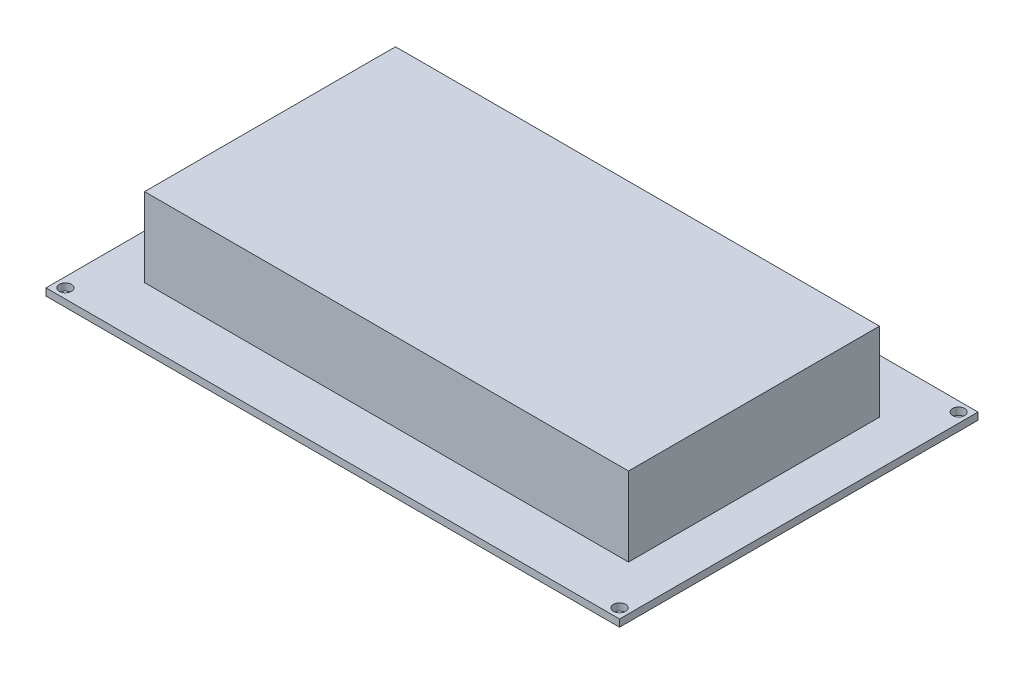
ISO-10303-21;
HEADER;
FILE_DESCRIPTION(('STEP AP214'),'2;1');
FILE_NAME('part.step','',(''),(''),'','','');
FILE_SCHEMA(('AUTOMOTIVE_DESIGN { 1 0 10303 214 1 1 1 1 }'));
ENDSEC;
DATA;
#1=APPLICATION_CONTEXT('core data for automotive mechanical design processes');
#2=APPLICATION_PROTOCOL_DEFINITION('international standard','automotive_design',2000,#1);
#3=PRODUCT_CONTEXT('',#1,'mechanical');
#4=PRODUCT('Part','Part','',(#3));
#5=PRODUCT_RELATED_PRODUCT_CATEGORY('part','',(#4));
#6=PRODUCT_DEFINITION_FORMATION('','',#4);
#7=PRODUCT_DEFINITION_CONTEXT('part definition',#1,'design');
#8=PRODUCT_DEFINITION('design','',#6,#7);
#9=PRODUCT_DEFINITION_SHAPE('','',#8);
#10=(LENGTH_UNIT() NAMED_UNIT(*) SI_UNIT(.MILLI.,.METRE.));
#11=(NAMED_UNIT(*) PLANE_ANGLE_UNIT() SI_UNIT($,.RADIAN.));
#12=(NAMED_UNIT(*) SI_UNIT($,.STERADIAN.) SOLID_ANGLE_UNIT());
#13=UNCERTAINTY_MEASURE_WITH_UNIT(LENGTH_MEASURE(1.E-05),#10,'distance_accuracy_value','');
#14=(GEOMETRIC_REPRESENTATION_CONTEXT(3) GLOBAL_UNCERTAINTY_ASSIGNED_CONTEXT((#13)) GLOBAL_UNIT_ASSIGNED_CONTEXT((#10,
#11,#12)) REPRESENTATION_CONTEXT('',''));
#15=CARTESIAN_POINT('',(0.,0.,0.));
#16=DIRECTION('',(0.,0.,1.));
#17=DIRECTION('',(1.,0.,0.));
#18=AXIS2_PLACEMENT_3D('',#15,#16,#17);
#19=CARTESIAN_POINT('',(0.,2.,0.));
#20=DIRECTION('',(0.,1.,0.));
#21=DIRECTION('',(0.,0.,1.));
#22=AXIS2_PLACEMENT_3D('',#19,#20,#21);
#23=PLANE('',#22);
#24=CARTESIAN_POINT('',(77.3000000000001,2.,47.3));
#25=DIRECTION('',(0.,1.,0.));
#26=DIRECTION('',(0.,0.,-1.));
#27=AXIS2_PLACEMENT_3D('',#24,#25,#26);
#28=CIRCLE('',#27,1.70000000000001);
#29=CARTESIAN_POINT('',(77.3000000000001,2.,45.6));
#30=VERTEX_POINT('',#29);
#31=EDGE_CURVE('E146',#30,#30,#28,.T.);
#32=ORIENTED_EDGE('',*,*,#31,.F.);
#33=EDGE_LOOP('',(#32));
#34=FACE_BOUND('',#33,.T.);
#35=CARTESIAN_POINT('',(-77.3,2.,47.3));
#36=DIRECTION('',(0.,1.,0.));
#37=DIRECTION('',(0.,0.,1.));
#38=AXIS2_PLACEMENT_3D('',#35,#36,#37);
#39=CIRCLE('',#38,1.70000000000001);
#40=CARTESIAN_POINT('',(-77.3,2.,49.));
#41=VERTEX_POINT('',#40);
#42=EDGE_CURVE('E152',#41,#41,#39,.T.);
#43=ORIENTED_EDGE('',*,*,#42,.F.);
#44=EDGE_LOOP('',(#43));
#45=FACE_BOUND('',#44,.T.);
#46=CARTESIAN_POINT('',(-77.3,2.,-47.3));
#47=DIRECTION('',(0.,1.,0.));
#48=DIRECTION('',(0.,0.,-1.));
#49=AXIS2_PLACEMENT_3D('',#46,#47,#48);
#50=CIRCLE('',#49,1.70000000000001);
#51=CARTESIAN_POINT('',(-77.3,2.,-49.));
#52=VERTEX_POINT('',#51);
#53=EDGE_CURVE('E134',#52,#52,#50,.T.);
#54=ORIENTED_EDGE('',*,*,#53,.F.);
#55=EDGE_LOOP('',(#54));
#56=FACE_BOUND('',#55,.T.);
#57=CARTESIAN_POINT('',(77.3,2.,-47.3));
#58=DIRECTION('',(0.,1.,0.));
#59=DIRECTION('',(0.,0.,1.));
#60=AXIS2_PLACEMENT_3D('',#57,#58,#59);
#61=CIRCLE('',#60,1.70000000000001);
#62=CARTESIAN_POINT('',(77.3,2.,-45.6));
#63=VERTEX_POINT('',#62);
#64=EDGE_CURVE('E145',#63,#63,#61,.T.);
#65=ORIENTED_EDGE('',*,*,#64,.F.);
#66=EDGE_LOOP('',(#65));
#67=FACE_BOUND('',#66,.T.);
#68=DIRECTION('',(0.,0.,1.));
#69=VECTOR('',#68,1.);
#70=CARTESIAN_POINT('',(-80.,2.,50.0000000000001));
#71=LINE('',#70,#69);
#72=CARTESIAN_POINT('',(-80.,2.,-50.));
#73=VERTEX_POINT('',#72);
#74=CARTESIAN_POINT('',(-80.,2.,50.0000000000001));
#75=VERTEX_POINT('',#74);
#76=EDGE_CURVE('E163',#73,#75,#71,.T.);
#77=ORIENTED_EDGE('',*,*,#76,.T.);
#78=DIRECTION('',(1.,0.,0.));
#79=VECTOR('',#78,1.);
#80=CARTESIAN_POINT('',(80.,2.,50.));
#81=LINE('',#80,#79);
#82=CARTESIAN_POINT('',(80.,2.,50.));
#83=VERTEX_POINT('',#82);
#84=EDGE_CURVE('E87',#75,#83,#81,.T.);
#85=ORIENTED_EDGE('',*,*,#84,.T.);
#86=DIRECTION('',(0.,0.,-1.));
#87=VECTOR('',#86,1.);
#88=CARTESIAN_POINT('',(80.,2.,50.));
#89=LINE('',#88,#87);
#90=CARTESIAN_POINT('',(80.,2.,-50.));
#91=VERTEX_POINT('',#90);
#92=EDGE_CURVE('E166',#83,#91,#89,.T.);
#93=ORIENTED_EDGE('',*,*,#92,.T.);
#94=DIRECTION('',(-1.,0.,0.));
#95=VECTOR('',#94,1.);
#96=CARTESIAN_POINT('',(80.,2.,-50.));
#97=LINE('',#96,#95);
#98=EDGE_CURVE('E59',#91,#73,#97,.T.);
#99=ORIENTED_EDGE('',*,*,#98,.T.);
#100=EDGE_LOOP('',(#77,#85,#93,#99));
#101=FACE_BOUND('',#100,.T.);
#102=DIRECTION('',(1.,0.,0.));
#103=VECTOR('',#102,1.);
#104=CARTESIAN_POINT('',(67.5,2.,35.));
#105=LINE('',#104,#103);
#106=CARTESIAN_POINT('',(-67.5,2.,35.));
#107=VERTEX_POINT('',#106);
#108=CARTESIAN_POINT('',(67.5,2.,35.));
#109=VERTEX_POINT('',#108);
#110=EDGE_CURVE('E333',#107,#109,#105,.T.);
#111=ORIENTED_EDGE('',*,*,#110,.F.);
#112=DIRECTION('',(0.,0.,1.));
#113=VECTOR('',#112,1.);
#114=CARTESIAN_POINT('',(-67.5,2.,35.));
#115=LINE('',#114,#113);
#116=CARTESIAN_POINT('',(-67.5,2.,-35.));
#117=VERTEX_POINT('',#116);
#118=EDGE_CURVE('E132',#117,#107,#115,.T.);
#119=ORIENTED_EDGE('',*,*,#118,.F.);
#120=DIRECTION('',(-1.,0.,0.));
#121=VECTOR('',#120,1.);
#122=CARTESIAN_POINT('',(67.5,2.,-35.));
#123=LINE('',#122,#121);
#124=CARTESIAN_POINT('',(67.5,2.,-35.));
#125=VERTEX_POINT('',#124);
#126=EDGE_CURVE('E128',#125,#117,#123,.T.);
#127=ORIENTED_EDGE('',*,*,#126,.F.);
#128=DIRECTION('',(0.,0.,-1.));
#129=VECTOR('',#128,1.);
#130=CARTESIAN_POINT('',(67.5,2.,35.));
#131=LINE('',#130,#129);
#132=EDGE_CURVE('E330',#109,#125,#131,.T.);
#133=ORIENTED_EDGE('',*,*,#132,.F.);
#134=EDGE_LOOP('',(#111,#119,#127,#133));
#135=FACE_BOUND('',#134,.T.);
#136=ADVANCED_FACE('F35',(#34,#45,#56,#67,#101,#135),#23,.T.);
#137=CARTESIAN_POINT('',(-80.,2.,50.0000000000001));
#138=DIRECTION('',(1.,0.,0.));
#139=DIRECTION('',(0.,0.,-1.));
#140=AXIS2_PLACEMENT_3D('',#137,#138,#139);
#141=PLANE('',#140);
#142=DIRECTION('',(0.,0.,1.));
#143=VECTOR('',#142,1.);
#144=CARTESIAN_POINT('',(-80.,0.,50.0000000000001));
#145=LINE('',#144,#143);
#146=CARTESIAN_POINT('',(-80.,0.,-50.));
#147=VERTEX_POINT('',#146);
#148=CARTESIAN_POINT('',(-80.,0.,50.0000000000001));
#149=VERTEX_POINT('',#148);
#150=EDGE_CURVE('E160',#147,#149,#145,.T.);
#151=ORIENTED_EDGE('',*,*,#150,.T.);
#152=DIRECTION('',(0.,-1.,0.));
#153=VECTOR('',#152,1.);
#154=CARTESIAN_POINT('',(-80.,2.,50.0000000000001));
#155=LINE('',#154,#153);
#156=EDGE_CURVE('E11',#75,#149,#155,.T.);
#157=ORIENTED_EDGE('',*,*,#156,.F.);
#158=ORIENTED_EDGE('',*,*,#76,.F.);
#159=DIRECTION('',(0.,-1.,0.));
#160=VECTOR('',#159,1.);
#161=CARTESIAN_POINT('',(-80.,2.,-50.));
#162=LINE('',#161,#160);
#163=EDGE_CURVE('E169',#73,#147,#162,.T.);
#164=ORIENTED_EDGE('',*,*,#163,.T.);
#165=EDGE_LOOP('',(#151,#157,#158,#164));
#166=FACE_BOUND('',#165,.T.);
#167=ADVANCED_FACE('F37',(#166),#141,.F.);
#168=CARTESIAN_POINT('',(80.,2.,50.));
#169=DIRECTION('',(0.,0.,-1.));
#170=DIRECTION('',(-1.,0.,0.));
#171=AXIS2_PLACEMENT_3D('',#168,#169,#170);
#172=PLANE('',#171);
#173=DIRECTION('',(1.,0.,0.));
#174=VECTOR('',#173,1.);
#175=CARTESIAN_POINT('',(80.,0.,50.));
#176=LINE('',#175,#174);
#177=CARTESIAN_POINT('',(80.,0.,50.));
#178=VERTEX_POINT('',#177);
#179=EDGE_CURVE('E172',#149,#178,#176,.T.);
#180=ORIENTED_EDGE('',*,*,#179,.T.);
#181=DIRECTION('',(0.,-1.,0.));
#182=VECTOR('',#181,1.);
#183=CARTESIAN_POINT('',(80.,2.,50.));
#184=LINE('',#183,#182);
#185=EDGE_CURVE('E43',#83,#178,#184,.T.);
#186=ORIENTED_EDGE('',*,*,#185,.F.);
#187=ORIENTED_EDGE('',*,*,#84,.F.);
#188=ORIENTED_EDGE('',*,*,#156,.T.);
#189=EDGE_LOOP('',(#180,#186,#187,#188));
#190=FACE_BOUND('',#189,.T.);
#191=ADVANCED_FACE('F201',(#190),#172,.F.);
#192=CARTESIAN_POINT('',(80.,2.,50.));
#193=DIRECTION('',(-1.,0.,0.));
#194=DIRECTION('',(0.,0.,1.));
#195=AXIS2_PLACEMENT_3D('',#192,#193,#194);
#196=PLANE('',#195);
#197=DIRECTION('',(0.,0.,-1.));
#198=VECTOR('',#197,1.);
#199=CARTESIAN_POINT('',(80.,0.,50.));
#200=LINE('',#199,#198);
#201=CARTESIAN_POINT('',(80.,0.,-50.));
#202=VERTEX_POINT('',#201);
#203=EDGE_CURVE('E174',#178,#202,#200,.T.);
#204=ORIENTED_EDGE('',*,*,#203,.T.);
#205=DIRECTION('',(0.,-1.,0.));
#206=VECTOR('',#205,1.);
#207=CARTESIAN_POINT('',(80.,2.,-50.));
#208=LINE('',#207,#206);
#209=EDGE_CURVE('E178',#91,#202,#208,.T.);
#210=ORIENTED_EDGE('',*,*,#209,.F.);
#211=ORIENTED_EDGE('',*,*,#92,.F.);
#212=ORIENTED_EDGE('',*,*,#185,.T.);
#213=EDGE_LOOP('',(#204,#210,#211,#212));
#214=FACE_BOUND('',#213,.T.);
#215=ADVANCED_FACE('F183',(#214),#196,.F.);
#216=CARTESIAN_POINT('',(80.,2.,-50.));
#217=DIRECTION('',(0.,0.,1.));
#218=DIRECTION('',(1.,0.,0.));
#219=AXIS2_PLACEMENT_3D('',#216,#217,#218);
#220=PLANE('',#219);
#221=DIRECTION('',(-1.,0.,0.));
#222=VECTOR('',#221,1.);
#223=CARTESIAN_POINT('',(80.,0.,-50.));
#224=LINE('',#223,#222);
#225=EDGE_CURVE('E80',#202,#147,#224,.T.);
#226=ORIENTED_EDGE('',*,*,#225,.T.);
#227=ORIENTED_EDGE('',*,*,#163,.F.);
#228=ORIENTED_EDGE('',*,*,#98,.F.);
#229=ORIENTED_EDGE('',*,*,#209,.T.);
#230=EDGE_LOOP('',(#226,#227,#228,#229));
#231=FACE_BOUND('',#230,.T.);
#232=ADVANCED_FACE('F191',(#231),#220,.F.);
#233=CARTESIAN_POINT('',(0.,0.,0.));
#234=DIRECTION('',(0.,1.,0.));
#235=DIRECTION('',(0.,0.,1.));
#236=AXIS2_PLACEMENT_3D('',#233,#234,#235);
#237=PLANE('',#236);
#238=CARTESIAN_POINT('',(77.3000000000001,0.,47.3));
#239=DIRECTION('',(0.,1.,0.));
#240=DIRECTION('',(0.,0.,-1.));
#241=AXIS2_PLACEMENT_3D('',#238,#239,#240);
#242=CIRCLE('',#241,1.70000000000001);
#243=CARTESIAN_POINT('',(77.3000000000001,0.,45.6));
#244=VERTEX_POINT('',#243);
#245=EDGE_CURVE('E142',#244,#244,#242,.T.);
#246=ORIENTED_EDGE('',*,*,#245,.T.);
#247=EDGE_LOOP('',(#246));
#248=FACE_BOUND('',#247,.T.);
#249=CARTESIAN_POINT('',(-77.3,0.,47.3));
#250=DIRECTION('',(0.,1.,0.));
#251=DIRECTION('',(0.,0.,1.));
#252=AXIS2_PLACEMENT_3D('',#249,#250,#251);
#253=CIRCLE('',#252,1.70000000000001);
#254=CARTESIAN_POINT('',(-77.3,0.,49.));
#255=VERTEX_POINT('',#254);
#256=EDGE_CURVE('E149',#255,#255,#253,.T.);
#257=ORIENTED_EDGE('',*,*,#256,.T.);
#258=EDGE_LOOP('',(#257));
#259=FACE_BOUND('',#258,.T.);
#260=CARTESIAN_POINT('',(-77.3,0.,-47.3));
#261=DIRECTION('',(0.,1.,0.));
#262=DIRECTION('',(0.,0.,-1.));
#263=AXIS2_PLACEMENT_3D('',#260,#261,#262);
#264=CIRCLE('',#263,1.70000000000001);
#265=CARTESIAN_POINT('',(-77.3,0.,-49.));
#266=VERTEX_POINT('',#265);
#267=EDGE_CURVE('E137',#266,#266,#264,.T.);
#268=ORIENTED_EDGE('',*,*,#267,.T.);
#269=EDGE_LOOP('',(#268));
#270=FACE_BOUND('',#269,.T.);
#271=CARTESIAN_POINT('',(77.3,0.,-47.3));
#272=DIRECTION('',(0.,1.,0.));
#273=DIRECTION('',(0.,0.,1.));
#274=AXIS2_PLACEMENT_3D('',#271,#272,#273);
#275=CIRCLE('',#274,1.70000000000001);
#276=CARTESIAN_POINT('',(77.3,0.,-45.6));
#277=VERTEX_POINT('',#276);
#278=EDGE_CURVE('E157',#277,#277,#275,.T.);
#279=ORIENTED_EDGE('',*,*,#278,.T.);
#280=EDGE_LOOP('',(#279));
#281=FACE_BOUND('',#280,.T.);
#282=ORIENTED_EDGE('',*,*,#150,.F.);
#283=ORIENTED_EDGE('',*,*,#225,.F.);
#284=ORIENTED_EDGE('',*,*,#203,.F.);
#285=ORIENTED_EDGE('',*,*,#179,.F.);
#286=EDGE_LOOP('',(#282,#283,#284,#285));
#287=FACE_BOUND('',#286,.T.);
#288=ADVANCED_FACE('F187',(#248,#259,#270,#281,#287),#237,.F.);
#289=CARTESIAN_POINT('',(77.3,0.,-47.3));
#290=DIRECTION('',(0.,1.,0.));
#291=DIRECTION('',(0.,0.,1.));
#292=AXIS2_PLACEMENT_3D('',#289,#290,#291);
#293=CYLINDRICAL_SURFACE('',#292,1.70000000000001);
#294=ORIENTED_EDGE('',*,*,#278,.F.);
#295=EDGE_LOOP('',(#294));
#296=FACE_BOUND('',#295,.T.);
#297=ORIENTED_EDGE('',*,*,#64,.T.);
#298=EDGE_LOOP('',(#297));
#299=FACE_BOUND('',#298,.T.);
#300=ADVANCED_FACE('F198',(#296,#299),#293,.F.);
#301=CARTESIAN_POINT('',(-77.3,0.,-47.3));
#302=DIRECTION('',(0.,1.,0.));
#303=DIRECTION('',(0.,0.,1.));
#304=AXIS2_PLACEMENT_3D('',#301,#302,#303);
#305=CYLINDRICAL_SURFACE('',#304,1.70000000000001);
#306=ORIENTED_EDGE('',*,*,#267,.F.);
#307=EDGE_LOOP('',(#306));
#308=FACE_BOUND('',#307,.T.);
#309=ORIENTED_EDGE('',*,*,#53,.T.);
#310=EDGE_LOOP('',(#309));
#311=FACE_BOUND('',#310,.T.);
#312=ADVANCED_FACE('F214',(#308,#311),#305,.F.);
#313=CARTESIAN_POINT('',(-77.3,0.,47.3));
#314=DIRECTION('',(0.,1.,0.));
#315=DIRECTION('',(0.,0.,1.));
#316=AXIS2_PLACEMENT_3D('',#313,#314,#315);
#317=CYLINDRICAL_SURFACE('',#316,1.70000000000001);
#318=ORIENTED_EDGE('',*,*,#256,.F.);
#319=EDGE_LOOP('',(#318));
#320=FACE_BOUND('',#319,.T.);
#321=ORIENTED_EDGE('',*,*,#42,.T.);
#322=EDGE_LOOP('',(#321));
#323=FACE_BOUND('',#322,.T.);
#324=ADVANCED_FACE('F218',(#320,#323),#317,.F.);
#325=CARTESIAN_POINT('',(77.3000000000001,0.,47.3));
#326=DIRECTION('',(0.,1.,0.));
#327=DIRECTION('',(0.,0.,1.));
#328=AXIS2_PLACEMENT_3D('',#325,#326,#327);
#329=CYLINDRICAL_SURFACE('',#328,1.70000000000001);
#330=ORIENTED_EDGE('',*,*,#245,.F.);
#331=EDGE_LOOP('',(#330));
#332=FACE_BOUND('',#331,.T.);
#333=ORIENTED_EDGE('',*,*,#31,.T.);
#334=EDGE_LOOP('',(#333));
#335=FACE_BOUND('',#334,.T.);
#336=ADVANCED_FACE('F222',(#332,#335),#329,.F.);
#337=CARTESIAN_POINT('',(-67.5,24.,35.));
#338=DIRECTION('',(1.,0.,0.));
#339=DIRECTION('',(0.,0.,-1.));
#340=AXIS2_PLACEMENT_3D('',#337,#338,#339);
#341=PLANE('',#340);
#342=ORIENTED_EDGE('',*,*,#118,.T.);
#343=DIRECTION('',(0.,-1.,0.));
#344=VECTOR('',#343,1.);
#345=CARTESIAN_POINT('',(-67.5,24.,35.));
#346=LINE('',#345,#344);
#347=CARTESIAN_POINT('',(-67.5,24.,35.));
#348=VERTEX_POINT('',#347);
#349=EDGE_CURVE('E113',#348,#107,#346,.T.);
#350=ORIENTED_EDGE('',*,*,#349,.F.);
#351=DIRECTION('',(0.,0.,1.));
#352=VECTOR('',#351,1.);
#353=CARTESIAN_POINT('',(-67.5,24.,35.));
#354=LINE('',#353,#352);
#355=CARTESIAN_POINT('',(-67.5,24.,-35.));
#356=VERTEX_POINT('',#355);
#357=EDGE_CURVE('E120',#356,#348,#354,.T.);
#358=ORIENTED_EDGE('',*,*,#357,.F.);
#359=DIRECTION('',(0.,-1.,0.));
#360=VECTOR('',#359,1.);
#361=CARTESIAN_POINT('',(-67.5,24.,-35.));
#362=LINE('',#361,#360);
#363=EDGE_CURVE('E327',#356,#117,#362,.T.);
#364=ORIENTED_EDGE('',*,*,#363,.T.);
#365=EDGE_LOOP('',(#342,#350,#358,#364));
#366=FACE_BOUND('',#365,.T.);
#367=ADVANCED_FACE('F130',(#366),#341,.F.);
#368=CARTESIAN_POINT('',(67.5,24.,35.));
#369=DIRECTION('',(0.,0.,-1.));
#370=DIRECTION('',(-1.,0.,0.));
#371=AXIS2_PLACEMENT_3D('',#368,#369,#370);
#372=PLANE('',#371);
#373=ORIENTED_EDGE('',*,*,#110,.T.);
#374=DIRECTION('',(0.,-1.,0.));
#375=VECTOR('',#374,1.);
#376=CARTESIAN_POINT('',(67.5,24.,35.));
#377=LINE('',#376,#375);
#378=CARTESIAN_POINT('',(67.5,24.,35.));
#379=VERTEX_POINT('',#378);
#380=EDGE_CURVE('E116',#379,#109,#377,.T.);
#381=ORIENTED_EDGE('',*,*,#380,.F.);
#382=DIRECTION('',(1.,0.,0.));
#383=VECTOR('',#382,1.);
#384=CARTESIAN_POINT('',(67.5,24.,35.));
#385=LINE('',#384,#383);
#386=EDGE_CURVE('E109',#348,#379,#385,.T.);
#387=ORIENTED_EDGE('',*,*,#386,.F.);
#388=ORIENTED_EDGE('',*,*,#349,.T.);
#389=EDGE_LOOP('',(#373,#381,#387,#388));
#390=FACE_BOUND('',#389,.T.);
#391=ADVANCED_FACE('F111',(#390),#372,.F.);
#392=CARTESIAN_POINT('',(67.5,24.,35.));
#393=DIRECTION('',(-1.,0.,0.));
#394=DIRECTION('',(0.,0.,1.));
#395=AXIS2_PLACEMENT_3D('',#392,#393,#394);
#396=PLANE('',#395);
#397=ORIENTED_EDGE('',*,*,#132,.T.);
#398=DIRECTION('',(0.,-1.,0.));
#399=VECTOR('',#398,1.);
#400=CARTESIAN_POINT('',(67.5,24.,-35.));
#401=LINE('',#400,#399);
#402=CARTESIAN_POINT('',(67.5,24.,-35.));
#403=VERTEX_POINT('',#402);
#404=EDGE_CURVE('E50',#403,#125,#401,.T.);
#405=ORIENTED_EDGE('',*,*,#404,.F.);
#406=DIRECTION('',(0.,0.,-1.));
#407=VECTOR('',#406,1.);
#408=CARTESIAN_POINT('',(67.5,24.,35.));
#409=LINE('',#408,#407);
#410=EDGE_CURVE('E119',#379,#403,#409,.T.);
#411=ORIENTED_EDGE('',*,*,#410,.F.);
#412=ORIENTED_EDGE('',*,*,#380,.T.);
#413=EDGE_LOOP('',(#397,#405,#411,#412));
#414=FACE_BOUND('',#413,.T.);
#415=ADVANCED_FACE('F231',(#414),#396,.F.);
#416=CARTESIAN_POINT('',(67.5,24.,-35.));
#417=DIRECTION('',(0.,0.,1.));
#418=DIRECTION('',(1.,0.,0.));
#419=AXIS2_PLACEMENT_3D('',#416,#417,#418);
#420=PLANE('',#419);
#421=ORIENTED_EDGE('',*,*,#126,.T.);
#422=ORIENTED_EDGE('',*,*,#363,.F.);
#423=DIRECTION('',(-1.,0.,0.));
#424=VECTOR('',#423,1.);
#425=CARTESIAN_POINT('',(67.5,24.,-35.));
#426=LINE('',#425,#424);
#427=EDGE_CURVE('E124',#403,#356,#426,.T.);
#428=ORIENTED_EDGE('',*,*,#427,.F.);
#429=ORIENTED_EDGE('',*,*,#404,.T.);
#430=EDGE_LOOP('',(#421,#422,#428,#429));
#431=FACE_BOUND('',#430,.T.);
#432=ADVANCED_FACE('F234',(#431),#420,.F.);
#433=CARTESIAN_POINT('',(0.,24.,0.));
#434=DIRECTION('',(0.,1.,0.));
#435=DIRECTION('',(0.,0.,1.));
#436=AXIS2_PLACEMENT_3D('',#433,#434,#435);
#437=PLANE('',#436);
#438=ORIENTED_EDGE('',*,*,#357,.T.);
#439=ORIENTED_EDGE('',*,*,#386,.T.);
#440=ORIENTED_EDGE('',*,*,#410,.T.);
#441=ORIENTED_EDGE('',*,*,#427,.T.);
#442=EDGE_LOOP('',(#438,#439,#440,#441));
#443=FACE_BOUND('',#442,.T.);
#444=ADVANCED_FACE('F123',(#443),#437,.T.);
#445=CLOSED_SHELL('',(#136,#167,#191,#215,#232,#288,#300,#312,#324,#336,#367,#391,#415,#432,#444));
#446=MANIFOLD_SOLID_BREP('B2',#445);
#447=ADVANCED_BREP_SHAPE_REPRESENTATION('',(#18,#446),#14);
#448=SHAPE_DEFINITION_REPRESENTATION(#9,#447);
ENDSEC;
END-ISO-10303-21;
